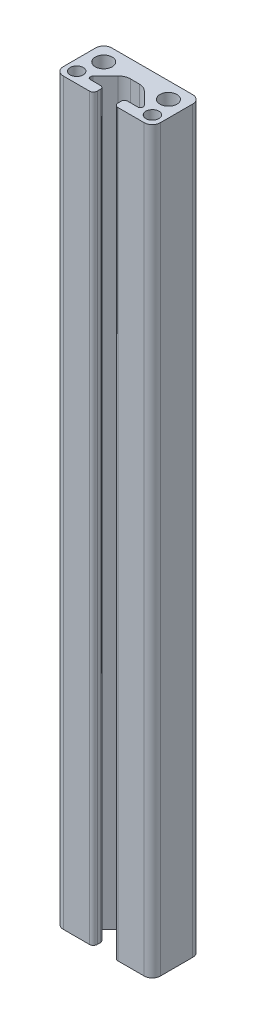
ISO-10303-21;
HEADER;
FILE_DESCRIPTION(('STEP AP214'),'2;1');
FILE_NAME('part.step','',(''),(''),'','','');
FILE_SCHEMA(('AUTOMOTIVE_DESIGN { 1 0 10303 214 1 1 1 1 }'));
ENDSEC;
DATA;
#1=APPLICATION_CONTEXT('core data for automotive mechanical design processes');
#2=APPLICATION_PROTOCOL_DEFINITION('international standard','automotive_design',2000,#1);
#3=PRODUCT_CONTEXT('',#1,'mechanical');
#4=PRODUCT('Part','Part','',(#3));
#5=PRODUCT_RELATED_PRODUCT_CATEGORY('part','',(#4));
#6=PRODUCT_DEFINITION_FORMATION('','',#4);
#7=PRODUCT_DEFINITION_CONTEXT('part definition',#1,'design');
#8=PRODUCT_DEFINITION('design','',#6,#7);
#9=PRODUCT_DEFINITION_SHAPE('','',#8);
#10=(LENGTH_UNIT() NAMED_UNIT(*) SI_UNIT(.MILLI.,.METRE.));
#11=(NAMED_UNIT(*) PLANE_ANGLE_UNIT() SI_UNIT($,.RADIAN.));
#12=(NAMED_UNIT(*) SI_UNIT($,.STERADIAN.) SOLID_ANGLE_UNIT());
#13=UNCERTAINTY_MEASURE_WITH_UNIT(LENGTH_MEASURE(1.E-05),#10,'distance_accuracy_value','');
#14=(GEOMETRIC_REPRESENTATION_CONTEXT(3) GLOBAL_UNCERTAINTY_ASSIGNED_CONTEXT((#13)) GLOBAL_UNIT_ASSIGNED_CONTEXT((#10,
#11,#12)) REPRESENTATION_CONTEXT('',''));
#15=CARTESIAN_POINT('',(0.,0.,0.));
#16=DIRECTION('',(0.,0.,1.));
#17=DIRECTION('',(1.,0.,0.));
#18=AXIS2_PLACEMENT_3D('',#15,#16,#17);
#19=CARTESIAN_POINT('',(-9.39799999999997,-145.,4.5719999999999));
#20=DIRECTION('',(0.,1.,0.));
#21=DIRECTION('',(0.,0.,1.));
#22=AXIS2_PLACEMENT_3D('',#19,#20,#21);
#23=CYLINDRICAL_SURFACE('',#22,0.889);
#24=CARTESIAN_POINT('',(-9.39799999999997,145.,4.5719999999999));
#25=DIRECTION('',(0.,1.,0.));
#26=DIRECTION('',(0.,0.,-1.));
#27=AXIS2_PLACEMENT_3D('',#24,#25,#26);
#28=CIRCLE('',#27,0.889);
#29=CARTESIAN_POINT('',(-10.287,145.,4.5719999999999));
#30=VERTEX_POINT('',#29);
#31=CARTESIAN_POINT('',(-9.39799999999997,145.,5.4609999999999));
#32=VERTEX_POINT('',#31);
#33=EDGE_CURVE('E354',#30,#32,#28,.T.);
#34=ORIENTED_EDGE('',*,*,#33,.T.);
#35=DIRECTION('',(0.,1.,0.));
#36=VECTOR('',#35,1.);
#37=CARTESIAN_POINT('',(-9.39799999999997,-145.,5.4609999999999));
#38=LINE('',#37,#36);
#39=CARTESIAN_POINT('',(-9.39799999999997,-145.,5.4609999999999));
#40=VERTEX_POINT('',#39);
#41=EDGE_CURVE('E13',#40,#32,#38,.T.);
#42=ORIENTED_EDGE('',*,*,#41,.F.);
#43=CARTESIAN_POINT('',(-9.39799999999997,-145.,4.5719999999999));
#44=DIRECTION('',(0.,1.,0.));
#45=DIRECTION('',(0.,0.,-1.));
#46=AXIS2_PLACEMENT_3D('',#43,#44,#45);
#47=CIRCLE('',#46,0.889);
#48=CARTESIAN_POINT('',(-10.287,-145.,4.5719999999999));
#49=VERTEX_POINT('',#48);
#50=EDGE_CURVE('E555',#49,#40,#47,.T.);
#51=ORIENTED_EDGE('',*,*,#50,.F.);
#52=DIRECTION('',(0.,1.,0.));
#53=VECTOR('',#52,1.);
#54=CARTESIAN_POINT('',(-10.287,-145.,4.5719999999999));
#55=LINE('',#54,#53);
#56=EDGE_CURVE('E338',#49,#30,#55,.T.);
#57=ORIENTED_EDGE('',*,*,#56,.T.);
#58=EDGE_LOOP('',(#34,#42,#51,#57));
#59=FACE_BOUND('',#58,.T.);
#60=ADVANCED_FACE('F125',(#59),#23,.F.);
#61=CARTESIAN_POINT('',(-9.39799999999997,-145.,5.4609999999999));
#62=DIRECTION('',(0.,0.,1.));
#63=DIRECTION('',(1.,0.,0.));
#64=AXIS2_PLACEMENT_3D('',#61,#62,#63);
#65=PLANE('',#64);
#66=DIRECTION('',(1.,0.,0.));
#67=VECTOR('',#66,1.);
#68=CARTESIAN_POINT('',(-9.39799999999997,145.,5.4609999999999));
#69=LINE('',#68,#67);
#70=CARTESIAN_POINT('',(-5.33399999999997,145.,5.4609999999999));
#71=VERTEX_POINT('',#70);
#72=EDGE_CURVE('E357',#32,#71,#69,.T.);
#73=ORIENTED_EDGE('',*,*,#72,.T.);
#74=DIRECTION('',(0.,1.,0.));
#75=VECTOR('',#74,1.);
#76=CARTESIAN_POINT('',(-5.33399999999997,-145.,5.4609999999999));
#77=LINE('',#76,#75);
#78=CARTESIAN_POINT('',(-5.33399999999997,-145.,5.4609999999999));
#79=VERTEX_POINT('',#78);
#80=EDGE_CURVE('E134',#79,#71,#77,.T.);
#81=ORIENTED_EDGE('',*,*,#80,.F.);
#82=DIRECTION('',(1.,0.,0.));
#83=VECTOR('',#82,1.);
#84=CARTESIAN_POINT('',(-9.39799999999997,-145.,5.4609999999999));
#85=LINE('',#84,#83);
#86=EDGE_CURVE('E245',#40,#79,#85,.T.);
#87=ORIENTED_EDGE('',*,*,#86,.F.);
#88=ORIENTED_EDGE('',*,*,#41,.T.);
#89=EDGE_LOOP('',(#73,#81,#87,#88));
#90=FACE_BOUND('',#89,.T.);
#91=ADVANCED_FACE('F570',(#90),#65,.F.);
#92=CARTESIAN_POINT('',(-5.33399999999997,-145.,6.7309999999999));
#93=DIRECTION('',(0.,1.,0.));
#94=DIRECTION('',(0.,0.,1.));
#95=AXIS2_PLACEMENT_3D('',#92,#93,#94);
#96=CYLINDRICAL_SURFACE('',#95,1.27);
#97=CARTESIAN_POINT('',(-5.33399999999997,145.,6.7309999999999));
#98=DIRECTION('',(0.,-1.,0.));
#99=DIRECTION('',(0.,0.,-1.));
#100=AXIS2_PLACEMENT_3D('',#97,#98,#99);
#101=CIRCLE('',#100,1.27);
#102=CARTESIAN_POINT('',(-4.06399999999997,145.,6.7309999999999));
#103=VERTEX_POINT('',#102);
#104=EDGE_CURVE('E359',#71,#103,#101,.T.);
#105=ORIENTED_EDGE('',*,*,#104,.T.);
#106=DIRECTION('',(0.,1.,0.));
#107=VECTOR('',#106,1.);
#108=CARTESIAN_POINT('',(-4.06399999999997,-145.,6.7309999999999));
#109=LINE('',#108,#107);
#110=CARTESIAN_POINT('',(-4.06399999999997,-145.,6.7309999999999));
#111=VERTEX_POINT('',#110);
#112=EDGE_CURVE('E475',#111,#103,#109,.T.);
#113=ORIENTED_EDGE('',*,*,#112,.F.);
#114=CARTESIAN_POINT('',(-5.33399999999997,-145.,6.7309999999999));
#115=DIRECTION('',(0.,-1.,0.));
#116=DIRECTION('',(0.,0.,-1.));
#117=AXIS2_PLACEMENT_3D('',#114,#115,#116);
#118=CIRCLE('',#117,1.27);
#119=EDGE_CURVE('E483',#79,#111,#118,.T.);
#120=ORIENTED_EDGE('',*,*,#119,.F.);
#121=ORIENTED_EDGE('',*,*,#80,.T.);
#122=EDGE_LOOP('',(#105,#113,#120,#121));
#123=FACE_BOUND('',#122,.T.);
#124=ADVANCED_FACE('F481',(#123),#96,.T.);
#125=CARTESIAN_POINT('',(-4.06399999999996,-145.,6.7309999999999));
#126=DIRECTION('',(-1.,0.,0.));
#127=DIRECTION('',(0.,0.,1.));
#128=AXIS2_PLACEMENT_3D('',#125,#126,#127);
#129=PLANE('',#128);
#130=DIRECTION('',(0.,0.,1.));
#131=VECTOR('',#130,1.);
#132=CARTESIAN_POINT('',(-4.06399999999996,145.,6.7309999999999));
#133=LINE('',#132,#131);
#134=CARTESIAN_POINT('',(-4.06399999999996,145.,8.00099999999999));
#135=VERTEX_POINT('',#134);
#136=EDGE_CURVE('E361',#103,#135,#133,.T.);
#137=ORIENTED_EDGE('',*,*,#136,.T.);
#138=DIRECTION('',(0.,1.,0.));
#139=VECTOR('',#138,1.);
#140=CARTESIAN_POINT('',(-4.06399999999996,-145.,8.00099999999999));
#141=LINE('',#140,#139);
#142=CARTESIAN_POINT('',(-4.06399999999996,-145.,8.00099999999999));
#143=VERTEX_POINT('',#142);
#144=EDGE_CURVE('E472',#143,#135,#141,.T.);
#145=ORIENTED_EDGE('',*,*,#144,.F.);
#146=DIRECTION('',(0.,0.,1.));
#147=VECTOR('',#146,1.);
#148=CARTESIAN_POINT('',(-4.06399999999996,-145.,6.7309999999999));
#149=LINE('',#148,#147);
#150=EDGE_CURVE('E501',#111,#143,#149,.T.);
#151=ORIENTED_EDGE('',*,*,#150,.F.);
#152=ORIENTED_EDGE('',*,*,#112,.T.);
#153=EDGE_LOOP('',(#137,#145,#151,#152));
#154=FACE_BOUND('',#153,.T.);
#155=ADVANCED_FACE('F492',(#154),#129,.F.);
#156=CARTESIAN_POINT('',(-5.58799999999996,-145.,8.00099999999999));
#157=DIRECTION('',(0.,1.,0.));
#158=DIRECTION('',(0.,0.,1.));
#159=AXIS2_PLACEMENT_3D('',#156,#157,#158);
#160=CYLINDRICAL_SURFACE('',#159,1.52399999999999);
#161=CARTESIAN_POINT('',(-5.58799999999996,145.,8.00099999999999));
#162=DIRECTION('',(0.,-1.,0.));
#163=DIRECTION('',(0.,0.,-1.));
#164=AXIS2_PLACEMENT_3D('',#161,#162,#163);
#165=CIRCLE('',#164,1.52399999999999);
#166=CARTESIAN_POINT('',(-5.58799999999996,145.,9.52499999999999));
#167=VERTEX_POINT('',#166);
#168=EDGE_CURVE('E363',#135,#167,#165,.T.);
#169=ORIENTED_EDGE('',*,*,#168,.T.);
#170=DIRECTION('',(0.,1.,0.));
#171=VECTOR('',#170,1.);
#172=CARTESIAN_POINT('',(-5.58799999999996,-145.,9.52499999999999));
#173=LINE('',#172,#171);
#174=CARTESIAN_POINT('',(-5.58799999999996,-145.,9.52499999999999));
#175=VERTEX_POINT('',#174);
#176=EDGE_CURVE('E469',#175,#167,#173,.T.);
#177=ORIENTED_EDGE('',*,*,#176,.F.);
#178=CARTESIAN_POINT('',(-5.58799999999996,-145.,8.00099999999999));
#179=DIRECTION('',(0.,-1.,0.));
#180=DIRECTION('',(0.,0.,-1.));
#181=AXIS2_PLACEMENT_3D('',#178,#179,#180);
#182=CIRCLE('',#181,1.52399999999999);
#183=EDGE_CURVE('E498',#143,#175,#182,.T.);
#184=ORIENTED_EDGE('',*,*,#183,.F.);
#185=ORIENTED_EDGE('',*,*,#144,.T.);
#186=EDGE_LOOP('',(#169,#177,#184,#185));
#187=FACE_BOUND('',#186,.T.);
#188=ADVANCED_FACE('F496',(#187),#160,.T.);
#189=CARTESIAN_POINT('',(-5.58799999999996,-145.,9.52499999999999));
#190=DIRECTION('',(0.,0.,-1.));
#191=DIRECTION('',(-1.,0.,0.));
#192=AXIS2_PLACEMENT_3D('',#189,#190,#191);
#193=PLANE('',#192);
#194=DIRECTION('',(-1.,0.,0.));
#195=VECTOR('',#194,1.);
#196=CARTESIAN_POINT('',(-5.58799999999996,145.,9.52499999999999));
#197=LINE('',#196,#195);
#198=CARTESIAN_POINT('',(-15.875,145.,9.52499999999998));
#199=VERTEX_POINT('',#198);
#200=EDGE_CURVE('E365',#167,#199,#197,.T.);
#201=ORIENTED_EDGE('',*,*,#200,.T.);
#202=DIRECTION('',(0.,1.,0.));
#203=VECTOR('',#202,1.);
#204=CARTESIAN_POINT('',(-15.875,-145.,9.52499999999998));
#205=LINE('',#204,#203);
#206=CARTESIAN_POINT('',(-15.875,-145.,9.52499999999998));
#207=VERTEX_POINT('',#206);
#208=EDGE_CURVE('E466',#207,#199,#205,.T.);
#209=ORIENTED_EDGE('',*,*,#208,.F.);
#210=DIRECTION('',(-1.,0.,0.));
#211=VECTOR('',#210,1.);
#212=CARTESIAN_POINT('',(-5.58799999999996,-145.,9.52499999999999));
#213=LINE('',#212,#211);
#214=EDGE_CURVE('E500',#175,#207,#213,.T.);
#215=ORIENTED_EDGE('',*,*,#214,.F.);
#216=ORIENTED_EDGE('',*,*,#176,.T.);
#217=EDGE_LOOP('',(#201,#209,#215,#216));
#218=FACE_BOUND('',#217,.T.);
#219=ADVANCED_FACE('F864',(#218),#193,.F.);
#220=CARTESIAN_POINT('',(-15.875,-145.,6.34999999999999));
#221=DIRECTION('',(0.,1.,0.));
#222=DIRECTION('',(0.,0.,1.));
#223=AXIS2_PLACEMENT_3D('',#220,#221,#222);
#224=CYLINDRICAL_SURFACE('',#223,3.175);
#225=CARTESIAN_POINT('',(-15.875,145.,6.34999999999999));
#226=DIRECTION('',(0.,-1.,0.));
#227=DIRECTION('',(0.,0.,-1.));
#228=AXIS2_PLACEMENT_3D('',#225,#226,#227);
#229=CIRCLE('',#228,3.175);
#230=CARTESIAN_POINT('',(-19.05,145.,6.34999999999999));
#231=VERTEX_POINT('',#230);
#232=EDGE_CURVE('E367',#199,#231,#229,.T.);
#233=ORIENTED_EDGE('',*,*,#232,.T.);
#234=DIRECTION('',(0.,1.,0.));
#235=VECTOR('',#234,1.);
#236=CARTESIAN_POINT('',(-19.05,-145.,6.34999999999999));
#237=LINE('',#236,#235);
#238=CARTESIAN_POINT('',(-19.05,-145.,6.34999999999999));
#239=VERTEX_POINT('',#238);
#240=EDGE_CURVE('E463',#239,#231,#237,.T.);
#241=ORIENTED_EDGE('',*,*,#240,.F.);
#242=CARTESIAN_POINT('',(-15.875,-145.,6.34999999999999));
#243=DIRECTION('',(0.,-1.,0.));
#244=DIRECTION('',(0.,0.,-1.));
#245=AXIS2_PLACEMENT_3D('',#242,#243,#244);
#246=CIRCLE('',#245,3.175);
#247=EDGE_CURVE('E503',#207,#239,#246,.T.);
#248=ORIENTED_EDGE('',*,*,#247,.F.);
#249=ORIENTED_EDGE('',*,*,#208,.T.);
#250=EDGE_LOOP('',(#233,#241,#248,#249));
#251=FACE_BOUND('',#250,.T.);
#252=ADVANCED_FACE('F853',(#251),#224,.T.);
#253=CARTESIAN_POINT('',(-19.05,-145.,6.34999999999999));
#254=DIRECTION('',(1.,0.,0.));
#255=DIRECTION('',(0.,0.,-1.));
#256=AXIS2_PLACEMENT_3D('',#253,#254,#255);
#257=PLANE('',#256);
#258=DIRECTION('',(0.,0.,-1.));
#259=VECTOR('',#258,1.);
#260=CARTESIAN_POINT('',(-19.05,145.,6.34999999999999));
#261=LINE('',#260,#259);
#262=CARTESIAN_POINT('',(-19.05,145.,-6.35000000000002));
#263=VERTEX_POINT('',#262);
#264=EDGE_CURVE('E369',#231,#263,#261,.T.);
#265=ORIENTED_EDGE('',*,*,#264,.T.);
#266=DIRECTION('',(0.,1.,0.));
#267=VECTOR('',#266,1.);
#268=CARTESIAN_POINT('',(-19.05,-145.,-6.35000000000002));
#269=LINE('',#268,#267);
#270=CARTESIAN_POINT('',(-19.05,-145.,-6.35000000000002));
#271=VERTEX_POINT('',#270);
#272=EDGE_CURVE('E460',#271,#263,#269,.T.);
#273=ORIENTED_EDGE('',*,*,#272,.F.);
#274=DIRECTION('',(0.,0.,-1.));
#275=VECTOR('',#274,1.);
#276=CARTESIAN_POINT('',(-19.05,-145.,6.34999999999999));
#277=LINE('',#276,#275);
#278=EDGE_CURVE('E509',#239,#271,#277,.T.);
#279=ORIENTED_EDGE('',*,*,#278,.F.);
#280=ORIENTED_EDGE('',*,*,#240,.T.);
#281=EDGE_LOOP('',(#265,#273,#279,#280));
#282=FACE_BOUND('',#281,.T.);
#283=ADVANCED_FACE('F842',(#282),#257,.F.);
#284=CARTESIAN_POINT('',(-15.875,-145.,-6.35000000000002));
#285=DIRECTION('',(0.,1.,0.));
#286=DIRECTION('',(0.,0.,1.));
#287=AXIS2_PLACEMENT_3D('',#284,#285,#286);
#288=CYLINDRICAL_SURFACE('',#287,3.175);
#289=CARTESIAN_POINT('',(-15.875,145.,-6.35000000000002));
#290=DIRECTION('',(0.,-1.,0.));
#291=DIRECTION('',(0.,0.,-1.));
#292=AXIS2_PLACEMENT_3D('',#289,#290,#291);
#293=CIRCLE('',#292,3.175);
#294=CARTESIAN_POINT('',(-15.875,145.,-9.52500000000001));
#295=VERTEX_POINT('',#294);
#296=EDGE_CURVE('E371',#263,#295,#293,.T.);
#297=ORIENTED_EDGE('',*,*,#296,.T.);
#298=DIRECTION('',(0.,1.,0.));
#299=VECTOR('',#298,1.);
#300=CARTESIAN_POINT('',(-15.875,-145.,-9.52500000000001));
#301=LINE('',#300,#299);
#302=CARTESIAN_POINT('',(-15.875,-145.,-9.52500000000001));
#303=VERTEX_POINT('',#302);
#304=EDGE_CURVE('E457',#303,#295,#301,.T.);
#305=ORIENTED_EDGE('',*,*,#304,.F.);
#306=CARTESIAN_POINT('',(-15.875,-145.,-6.35000000000002));
#307=DIRECTION('',(0.,-1.,0.));
#308=DIRECTION('',(0.,0.,-1.));
#309=AXIS2_PLACEMENT_3D('',#306,#307,#308);
#310=CIRCLE('',#309,3.175);
#311=EDGE_CURVE('E511',#271,#303,#310,.T.);
#312=ORIENTED_EDGE('',*,*,#311,.F.);
#313=ORIENTED_EDGE('',*,*,#272,.T.);
#314=EDGE_LOOP('',(#297,#305,#312,#313));
#315=FACE_BOUND('',#314,.T.);
#316=ADVANCED_FACE('F831',(#315),#288,.T.);
#317=CARTESIAN_POINT('',(-15.875,-145.,-9.52500000000001));
#318=DIRECTION('',(0.,0.,1.));
#319=DIRECTION('',(1.,0.,0.));
#320=AXIS2_PLACEMENT_3D('',#317,#318,#319);
#321=PLANE('',#320);
#322=DIRECTION('',(1.,0.,0.));
#323=VECTOR('',#322,1.);
#324=CARTESIAN_POINT('',(-15.875,145.,-9.52500000000001));
#325=LINE('',#324,#323);
#326=CARTESIAN_POINT('',(15.875,145.,-9.52500000000002));
#327=VERTEX_POINT('',#326);
#328=EDGE_CURVE('E373',#295,#327,#325,.T.);
#329=ORIENTED_EDGE('',*,*,#328,.T.);
#330=DIRECTION('',(0.,1.,0.));
#331=VECTOR('',#330,1.);
#332=CARTESIAN_POINT('',(15.875,-145.,-9.52500000000002));
#333=LINE('',#332,#331);
#334=CARTESIAN_POINT('',(15.875,-145.,-9.52500000000002));
#335=VERTEX_POINT('',#334);
#336=EDGE_CURVE('E454',#335,#327,#333,.T.);
#337=ORIENTED_EDGE('',*,*,#336,.F.);
#338=DIRECTION('',(1.,0.,0.));
#339=VECTOR('',#338,1.);
#340=CARTESIAN_POINT('',(-15.875,-145.,-9.52500000000001));
#341=LINE('',#340,#339);
#342=EDGE_CURVE('E513',#303,#335,#341,.T.);
#343=ORIENTED_EDGE('',*,*,#342,.F.);
#344=ORIENTED_EDGE('',*,*,#304,.T.);
#345=EDGE_LOOP('',(#329,#337,#343,#344));
#346=FACE_BOUND('',#345,.T.);
#347=ADVANCED_FACE('F820',(#346),#321,.F.);
#348=CARTESIAN_POINT('',(15.875,-145.,-6.35000000000002));
#349=DIRECTION('',(0.,1.,0.));
#350=DIRECTION('',(0.,0.,1.));
#351=AXIS2_PLACEMENT_3D('',#348,#349,#350);
#352=CYLINDRICAL_SURFACE('',#351,3.175);
#353=CARTESIAN_POINT('',(15.875,145.,-6.35000000000002));
#354=DIRECTION('',(0.,-1.,0.));
#355=DIRECTION('',(0.,0.,-1.));
#356=AXIS2_PLACEMENT_3D('',#353,#354,#355);
#357=CIRCLE('',#356,3.175);
#358=CARTESIAN_POINT('',(19.05,145.,-6.35000000000002));
#359=VERTEX_POINT('',#358);
#360=EDGE_CURVE('E375',#327,#359,#357,.T.);
#361=ORIENTED_EDGE('',*,*,#360,.T.);
#362=DIRECTION('',(0.,1.,0.));
#363=VECTOR('',#362,1.);
#364=CARTESIAN_POINT('',(19.05,-145.,-6.35000000000002));
#365=LINE('',#364,#363);
#366=CARTESIAN_POINT('',(19.05,-145.,-6.35000000000002));
#367=VERTEX_POINT('',#366);
#368=EDGE_CURVE('E451',#367,#359,#365,.T.);
#369=ORIENTED_EDGE('',*,*,#368,.F.);
#370=CARTESIAN_POINT('',(15.875,-145.,-6.35000000000002));
#371=DIRECTION('',(0.,-1.,0.));
#372=DIRECTION('',(0.,0.,-1.));
#373=AXIS2_PLACEMENT_3D('',#370,#371,#372);
#374=CIRCLE('',#373,3.175);
#375=EDGE_CURVE('E515',#335,#367,#374,.T.);
#376=ORIENTED_EDGE('',*,*,#375,.F.);
#377=ORIENTED_EDGE('',*,*,#336,.T.);
#378=EDGE_LOOP('',(#361,#369,#376,#377));
#379=FACE_BOUND('',#378,.T.);
#380=ADVANCED_FACE('F809',(#379),#352,.T.);
#381=CARTESIAN_POINT('',(19.05,-145.,-6.35000000000002));
#382=DIRECTION('',(-1.,0.,0.));
#383=DIRECTION('',(0.,0.,1.));
#384=AXIS2_PLACEMENT_3D('',#381,#382,#383);
#385=PLANE('',#384);
#386=DIRECTION('',(0.,0.,1.));
#387=VECTOR('',#386,1.);
#388=CARTESIAN_POINT('',(19.05,145.,-6.35000000000002));
#389=LINE('',#388,#387);
#390=CARTESIAN_POINT('',(19.05,145.,6.34999999999998));
#391=VERTEX_POINT('',#390);
#392=EDGE_CURVE('E377',#359,#391,#389,.T.);
#393=ORIENTED_EDGE('',*,*,#392,.T.);
#394=DIRECTION('',(0.,1.,0.));
#395=VECTOR('',#394,1.);
#396=CARTESIAN_POINT('',(19.05,-145.,6.34999999999998));
#397=LINE('',#396,#395);
#398=CARTESIAN_POINT('',(19.05,-145.,6.34999999999998));
#399=VERTEX_POINT('',#398);
#400=EDGE_CURVE('E448',#399,#391,#397,.T.);
#401=ORIENTED_EDGE('',*,*,#400,.F.);
#402=DIRECTION('',(0.,0.,1.));
#403=VECTOR('',#402,1.);
#404=CARTESIAN_POINT('',(19.05,-145.,-6.35000000000002));
#405=LINE('',#404,#403);
#406=EDGE_CURVE('E517',#367,#399,#405,.T.);
#407=ORIENTED_EDGE('',*,*,#406,.F.);
#408=ORIENTED_EDGE('',*,*,#368,.T.);
#409=EDGE_LOOP('',(#393,#401,#407,#408));
#410=FACE_BOUND('',#409,.T.);
#411=ADVANCED_FACE('F798',(#410),#385,.F.);
#412=CARTESIAN_POINT('',(15.875,-145.,6.34999999999998));
#413=DIRECTION('',(0.,1.,0.));
#414=DIRECTION('',(0.,0.,1.));
#415=AXIS2_PLACEMENT_3D('',#412,#413,#414);
#416=CYLINDRICAL_SURFACE('',#415,3.175);
#417=CARTESIAN_POINT('',(15.875,145.,6.34999999999998));
#418=DIRECTION('',(0.,-1.,0.));
#419=DIRECTION('',(0.,0.,-1.));
#420=AXIS2_PLACEMENT_3D('',#417,#418,#419);
#421=CIRCLE('',#420,3.175);
#422=CARTESIAN_POINT('',(15.875,145.,9.52499999999999));
#423=VERTEX_POINT('',#422);
#424=EDGE_CURVE('E379',#391,#423,#421,.T.);
#425=ORIENTED_EDGE('',*,*,#424,.T.);
#426=DIRECTION('',(0.,1.,0.));
#427=VECTOR('',#426,1.);
#428=CARTESIAN_POINT('',(15.875,-145.,9.52499999999999));
#429=LINE('',#428,#427);
#430=CARTESIAN_POINT('',(15.875,-145.,9.52499999999999));
#431=VERTEX_POINT('',#430);
#432=EDGE_CURVE('E445',#431,#423,#429,.T.);
#433=ORIENTED_EDGE('',*,*,#432,.F.);
#434=CARTESIAN_POINT('',(15.875,-145.,6.34999999999998));
#435=DIRECTION('',(0.,-1.,0.));
#436=DIRECTION('',(0.,0.,-1.));
#437=AXIS2_PLACEMENT_3D('',#434,#435,#436);
#438=CIRCLE('',#437,3.175);
#439=EDGE_CURVE('E519',#399,#431,#438,.T.);
#440=ORIENTED_EDGE('',*,*,#439,.F.);
#441=ORIENTED_EDGE('',*,*,#400,.T.);
#442=EDGE_LOOP('',(#425,#433,#440,#441));
#443=FACE_BOUND('',#442,.T.);
#444=ADVANCED_FACE('F787',(#443),#416,.T.);
#445=CARTESIAN_POINT('',(15.875,-145.,9.52499999999999));
#446=DIRECTION('',(0.,0.,-1.));
#447=DIRECTION('',(-1.,0.,0.));
#448=AXIS2_PLACEMENT_3D('',#445,#446,#447);
#449=PLANE('',#448);
#450=DIRECTION('',(-1.,0.,0.));
#451=VECTOR('',#450,1.);
#452=CARTESIAN_POINT('',(15.875,145.,9.52499999999999));
#453=LINE('',#452,#451);
#454=CARTESIAN_POINT('',(5.58800000000002,145.,9.52499999999999));
#455=VERTEX_POINT('',#454);
#456=EDGE_CURVE('E381',#423,#455,#453,.T.);
#457=ORIENTED_EDGE('',*,*,#456,.T.);
#458=DIRECTION('',(0.,1.,0.));
#459=VECTOR('',#458,1.);
#460=CARTESIAN_POINT('',(5.58800000000002,-145.,9.52499999999999));
#461=LINE('',#460,#459);
#462=CARTESIAN_POINT('',(5.58800000000002,-145.,9.52499999999999));
#463=VERTEX_POINT('',#462);
#464=EDGE_CURVE('E442',#463,#455,#461,.T.);
#465=ORIENTED_EDGE('',*,*,#464,.F.);
#466=DIRECTION('',(-1.,0.,0.));
#467=VECTOR('',#466,1.);
#468=CARTESIAN_POINT('',(15.875,-145.,9.52499999999999));
#469=LINE('',#468,#467);
#470=EDGE_CURVE('E521',#431,#463,#469,.T.);
#471=ORIENTED_EDGE('',*,*,#470,.F.);
#472=ORIENTED_EDGE('',*,*,#432,.T.);
#473=EDGE_LOOP('',(#457,#465,#471,#472));
#474=FACE_BOUND('',#473,.T.);
#475=ADVANCED_FACE('F776',(#474),#449,.F.);
#476=CARTESIAN_POINT('',(5.58800000000002,-145.,8.00100000000001));
#477=DIRECTION('',(0.,1.,0.));
#478=DIRECTION('',(0.,0.,1.));
#479=AXIS2_PLACEMENT_3D('',#476,#477,#478);
#480=CYLINDRICAL_SURFACE('',#479,1.52399999999998);
#481=CARTESIAN_POINT('',(5.58800000000002,145.,8.00100000000001));
#482=DIRECTION('',(0.,-1.,0.));
#483=DIRECTION('',(0.,0.,-1.));
#484=AXIS2_PLACEMENT_3D('',#481,#482,#483);
#485=CIRCLE('',#484,1.52399999999998);
#486=CARTESIAN_POINT('',(4.06400000000004,145.,8.00100000000001));
#487=VERTEX_POINT('',#486);
#488=EDGE_CURVE('E383',#455,#487,#485,.T.);
#489=ORIENTED_EDGE('',*,*,#488,.T.);
#490=DIRECTION('',(0.,1.,0.));
#491=VECTOR('',#490,1.);
#492=CARTESIAN_POINT('',(4.06400000000004,-145.,8.00100000000001));
#493=LINE('',#492,#491);
#494=CARTESIAN_POINT('',(4.06400000000004,-145.,8.00100000000001));
#495=VERTEX_POINT('',#494);
#496=EDGE_CURVE('E439',#495,#487,#493,.T.);
#497=ORIENTED_EDGE('',*,*,#496,.F.);
#498=CARTESIAN_POINT('',(5.58800000000002,-145.,8.00100000000001));
#499=DIRECTION('',(0.,-1.,0.));
#500=DIRECTION('',(0.,0.,-1.));
#501=AXIS2_PLACEMENT_3D('',#498,#499,#500);
#502=CIRCLE('',#501,1.52399999999998);
#503=EDGE_CURVE('E523',#463,#495,#502,.T.);
#504=ORIENTED_EDGE('',*,*,#503,.F.);
#505=ORIENTED_EDGE('',*,*,#464,.T.);
#506=EDGE_LOOP('',(#489,#497,#504,#505));
#507=FACE_BOUND('',#506,.T.);
#508=ADVANCED_FACE('F765',(#507),#480,.T.);
#509=CARTESIAN_POINT('',(4.06400000000004,-145.,8.00100000000001));
#510=DIRECTION('',(1.,0.,0.));
#511=DIRECTION('',(0.,0.,-1.));
#512=AXIS2_PLACEMENT_3D('',#509,#510,#511);
#513=PLANE('',#512);
#514=DIRECTION('',(0.,0.,-1.));
#515=VECTOR('',#514,1.);
#516=CARTESIAN_POINT('',(4.06400000000004,145.,8.00100000000001));
#517=LINE('',#516,#515);
#518=CARTESIAN_POINT('',(4.06400000000003,145.,6.73099999999988));
#519=VERTEX_POINT('',#518);
#520=EDGE_CURVE('E385',#487,#519,#517,.T.);
#521=ORIENTED_EDGE('',*,*,#520,.T.);
#522=DIRECTION('',(0.,1.,0.));
#523=VECTOR('',#522,1.);
#524=CARTESIAN_POINT('',(4.06400000000003,-145.,6.73099999999988));
#525=LINE('',#524,#523);
#526=CARTESIAN_POINT('',(4.06400000000003,-145.,6.73099999999988));
#527=VERTEX_POINT('',#526);
#528=EDGE_CURVE('E436',#527,#519,#525,.T.);
#529=ORIENTED_EDGE('',*,*,#528,.F.);
#530=DIRECTION('',(0.,0.,-1.));
#531=VECTOR('',#530,1.);
#532=CARTESIAN_POINT('',(4.06400000000004,-145.,8.00100000000001));
#533=LINE('',#532,#531);
#534=EDGE_CURVE('E525',#495,#527,#533,.T.);
#535=ORIENTED_EDGE('',*,*,#534,.F.);
#536=ORIENTED_EDGE('',*,*,#496,.T.);
#537=EDGE_LOOP('',(#521,#529,#535,#536));
#538=FACE_BOUND('',#537,.T.);
#539=ADVANCED_FACE('F754',(#538),#513,.F.);
#540=CARTESIAN_POINT('',(5.33400000000001,-145.,6.73099999999988));
#541=DIRECTION('',(0.,1.,0.));
#542=DIRECTION('',(0.,0.,1.));
#543=AXIS2_PLACEMENT_3D('',#540,#541,#542);
#544=CYLINDRICAL_SURFACE('',#543,1.26999999999998);
#545=CARTESIAN_POINT('',(5.33400000000001,145.,6.73099999999988));
#546=DIRECTION('',(0.,-1.,0.));
#547=DIRECTION('',(0.,0.,-1.));
#548=AXIS2_PLACEMENT_3D('',#545,#546,#547);
#549=CIRCLE('',#548,1.26999999999998);
#550=CARTESIAN_POINT('',(5.33400000000001,145.,5.4609999999999));
#551=VERTEX_POINT('',#550);
#552=EDGE_CURVE('E387',#519,#551,#549,.T.);
#553=ORIENTED_EDGE('',*,*,#552,.T.);
#554=DIRECTION('',(0.,1.,0.));
#555=VECTOR('',#554,1.);
#556=CARTESIAN_POINT('',(5.33400000000001,-145.,5.4609999999999));
#557=LINE('',#556,#555);
#558=CARTESIAN_POINT('',(5.33400000000001,-145.,5.4609999999999));
#559=VERTEX_POINT('',#558);
#560=EDGE_CURVE('E433',#559,#551,#557,.T.);
#561=ORIENTED_EDGE('',*,*,#560,.F.);
#562=CARTESIAN_POINT('',(5.33400000000001,-145.,6.73099999999988));
#563=DIRECTION('',(0.,-1.,0.));
#564=DIRECTION('',(0.,0.,-1.));
#565=AXIS2_PLACEMENT_3D('',#562,#563,#564);
#566=CIRCLE('',#565,1.26999999999998);
#567=EDGE_CURVE('E527',#527,#559,#566,.T.);
#568=ORIENTED_EDGE('',*,*,#567,.F.);
#569=ORIENTED_EDGE('',*,*,#528,.T.);
#570=EDGE_LOOP('',(#553,#561,#568,#569));
#571=FACE_BOUND('',#570,.T.);
#572=ADVANCED_FACE('F743',(#571),#544,.T.);
#573=CARTESIAN_POINT('',(5.33400000000001,-145.,5.4609999999999));
#574=DIRECTION('',(0.,0.,1.));
#575=DIRECTION('',(1.,0.,0.));
#576=AXIS2_PLACEMENT_3D('',#573,#574,#575);
#577=PLANE('',#576);
#578=DIRECTION('',(1.,0.,0.));
#579=VECTOR('',#578,1.);
#580=CARTESIAN_POINT('',(5.33400000000001,145.,5.4609999999999));
#581=LINE('',#580,#579);
#582=CARTESIAN_POINT('',(9.39800000000004,145.,5.4609999999999));
#583=VERTEX_POINT('',#582);
#584=EDGE_CURVE('E389',#551,#583,#581,.T.);
#585=ORIENTED_EDGE('',*,*,#584,.T.);
#586=DIRECTION('',(0.,1.,0.));
#587=VECTOR('',#586,1.);
#588=CARTESIAN_POINT('',(9.39800000000004,-145.,5.4609999999999));
#589=LINE('',#588,#587);
#590=CARTESIAN_POINT('',(9.39800000000004,-145.,5.4609999999999));
#591=VERTEX_POINT('',#590);
#592=EDGE_CURVE('E430',#591,#583,#589,.T.);
#593=ORIENTED_EDGE('',*,*,#592,.F.);
#594=DIRECTION('',(1.,0.,0.));
#595=VECTOR('',#594,1.);
#596=CARTESIAN_POINT('',(5.33400000000001,-145.,5.4609999999999));
#597=LINE('',#596,#595);
#598=EDGE_CURVE('E529',#559,#591,#597,.T.);
#599=ORIENTED_EDGE('',*,*,#598,.F.);
#600=ORIENTED_EDGE('',*,*,#560,.T.);
#601=EDGE_LOOP('',(#585,#593,#599,#600));
#602=FACE_BOUND('',#601,.T.);
#603=ADVANCED_FACE('F732',(#602),#577,.F.);
#604=CARTESIAN_POINT('',(9.39800000000004,-145.,4.5719999999999));
#605=DIRECTION('',(0.,1.,0.));
#606=DIRECTION('',(0.,0.,1.));
#607=AXIS2_PLACEMENT_3D('',#604,#605,#606);
#608=CYLINDRICAL_SURFACE('',#607,0.888999999999999);
#609=CARTESIAN_POINT('',(9.39800000000004,145.,4.5719999999999));
#610=DIRECTION('',(0.,1.,0.));
#611=DIRECTION('',(0.,0.,-1.));
#612=AXIS2_PLACEMENT_3D('',#609,#610,#611);
#613=CIRCLE('',#612,0.888999999999999);
#614=CARTESIAN_POINT('',(10.287,145.,4.5719999999999));
#615=VERTEX_POINT('',#614);
#616=EDGE_CURVE('E391',#583,#615,#613,.T.);
#617=ORIENTED_EDGE('',*,*,#616,.T.);
#618=DIRECTION('',(0.,1.,0.));
#619=VECTOR('',#618,1.);
#620=CARTESIAN_POINT('',(10.287,-145.,4.5719999999999));
#621=LINE('',#620,#619);
#622=CARTESIAN_POINT('',(10.287,-145.,4.5719999999999));
#623=VERTEX_POINT('',#622);
#624=EDGE_CURVE('E427',#623,#615,#621,.T.);
#625=ORIENTED_EDGE('',*,*,#624,.F.);
#626=CARTESIAN_POINT('',(9.39800000000004,-145.,4.5719999999999));
#627=DIRECTION('',(0.,1.,0.));
#628=DIRECTION('',(0.,0.,-1.));
#629=AXIS2_PLACEMENT_3D('',#626,#627,#628);
#630=CIRCLE('',#629,0.888999999999999);
#631=EDGE_CURVE('E531',#591,#623,#630,.T.);
#632=ORIENTED_EDGE('',*,*,#631,.F.);
#633=ORIENTED_EDGE('',*,*,#592,.T.);
#634=EDGE_LOOP('',(#617,#625,#632,#633));
#635=FACE_BOUND('',#634,.T.);
#636=ADVANCED_FACE('F721',(#635),#608,.F.);
#637=CARTESIAN_POINT('',(10.287,-145.,4.5719999999999));
#638=DIRECTION('',(1.,0.,0.));
#639=DIRECTION('',(0.,0.,-1.));
#640=AXIS2_PLACEMENT_3D('',#637,#638,#639);
#641=PLANE('',#640);
#642=DIRECTION('',(0.,0.,-1.));
#643=VECTOR('',#642,1.);
#644=CARTESIAN_POINT('',(10.287,145.,4.5719999999999));
#645=LINE('',#644,#643);
#646=CARTESIAN_POINT('',(10.287,145.,4.25536498708179));
#647=VERTEX_POINT('',#646);
#648=EDGE_CURVE('E393',#615,#647,#645,.T.);
#649=ORIENTED_EDGE('',*,*,#648,.T.);
#650=DIRECTION('',(0.,1.,0.));
#651=VECTOR('',#650,1.);
#652=CARTESIAN_POINT('',(10.287,-145.,4.25536498708179));
#653=LINE('',#652,#651);
#654=CARTESIAN_POINT('',(10.287,-145.,4.25536498708179));
#655=VERTEX_POINT('',#654);
#656=EDGE_CURVE('E424',#655,#647,#653,.T.);
#657=ORIENTED_EDGE('',*,*,#656,.F.);
#658=DIRECTION('',(0.,0.,-1.));
#659=VECTOR('',#658,1.);
#660=CARTESIAN_POINT('',(10.287,-145.,4.5719999999999));
#661=LINE('',#660,#659);
#662=EDGE_CURVE('E533',#623,#655,#661,.T.);
#663=ORIENTED_EDGE('',*,*,#662,.F.);
#664=ORIENTED_EDGE('',*,*,#624,.T.);
#665=EDGE_LOOP('',(#649,#657,#663,#664));
#666=FACE_BOUND('',#665,.T.);
#667=ADVANCED_FACE('F710',(#666),#641,.F.);
#668=CARTESIAN_POINT('',(9.39800000000006,-145.,4.25536498708179));
#669=DIRECTION('',(0.,1.,0.));
#670=DIRECTION('',(0.,0.,1.));
#671=AXIS2_PLACEMENT_3D('',#668,#669,#670);
#672=CYLINDRICAL_SURFACE('',#671,0.888999999999977);
#673=CARTESIAN_POINT('',(9.39800000000006,145.,4.25536498708179));
#674=DIRECTION('',(0.,1.,0.));
#675=DIRECTION('',(0.,0.,-1.));
#676=AXIS2_PLACEMENT_3D('',#673,#674,#675);
#677=CIRCLE('',#676,0.888999999999977);
#678=CARTESIAN_POINT('',(10.0266179284749,145.,3.62674705860696));
#679=VERTEX_POINT('',#678);
#680=EDGE_CURVE('E395',#647,#679,#677,.T.);
#681=ORIENTED_EDGE('',*,*,#680,.T.);
#682=DIRECTION('',(0.,1.,0.));
#683=VECTOR('',#682,1.);
#684=CARTESIAN_POINT('',(10.0266179284749,-145.,3.62674705860696));
#685=LINE('',#684,#683);
#686=CARTESIAN_POINT('',(10.0266179284749,-145.,3.62674705860696));
#687=VERTEX_POINT('',#686);
#688=EDGE_CURVE('E421',#687,#679,#685,.T.);
#689=ORIENTED_EDGE('',*,*,#688,.F.);
#690=CARTESIAN_POINT('',(9.39800000000006,-145.,4.25536498708179));
#691=DIRECTION('',(0.,1.,0.));
#692=DIRECTION('',(0.,0.,-1.));
#693=AXIS2_PLACEMENT_3D('',#690,#691,#692);
#694=CIRCLE('',#693,0.888999999999977);
#695=EDGE_CURVE('E535',#655,#687,#694,.T.);
#696=ORIENTED_EDGE('',*,*,#695,.F.);
#697=ORIENTED_EDGE('',*,*,#656,.T.);
#698=EDGE_LOOP('',(#681,#689,#696,#697));
#699=FACE_BOUND('',#698,.T.);
#700=ADVANCED_FACE('F699',(#699),#672,.F.);
#701=CARTESIAN_POINT('',(10.0266179284749,-145.,3.62674705860696));
#702=DIRECTION('',(0.707106781186548,0.,-0.707106781186547));
#703=DIRECTION('',(-0.707106781186547,0.,-0.707106781186548));
#704=AXIS2_PLACEMENT_3D('',#701,#702,#703);
#705=PLANE('',#704);
#706=DIRECTION('',(-0.707106781186547,0.,-0.707106781186548));
#707=VECTOR('',#706,1.);
#708=CARTESIAN_POINT('',(10.0266179284749,145.,3.62674705860696));
#709=LINE('',#708,#707);
#710=CARTESIAN_POINT('',(5.12405508058805,145.,-1.27581578927987));
#711=VERTEX_POINT('',#710);
#712=EDGE_CURVE('E397',#679,#711,#709,.T.);
#713=ORIENTED_EDGE('',*,*,#712,.T.);
#714=DIRECTION('',(0.,1.,0.));
#715=VECTOR('',#714,1.);
#716=CARTESIAN_POINT('',(5.12405508058805,-145.,-1.27581578927987));
#717=LINE('',#716,#715);
#718=CARTESIAN_POINT('',(5.12405508058805,-145.,-1.27581578927987));
#719=VERTEX_POINT('',#718);
#720=EDGE_CURVE('E418',#719,#711,#717,.T.);
#721=ORIENTED_EDGE('',*,*,#720,.F.);
#722=DIRECTION('',(-0.707106781186547,0.,-0.707106781186548));
#723=VECTOR('',#722,1.);
#724=CARTESIAN_POINT('',(10.0266179284749,-145.,3.62674705860696));
#725=LINE('',#724,#723);
#726=EDGE_CURVE('E537',#687,#719,#725,.T.);
#727=ORIENTED_EDGE('',*,*,#726,.F.);
#728=ORIENTED_EDGE('',*,*,#688,.T.);
#729=EDGE_LOOP('',(#713,#721,#727,#728));
#730=FACE_BOUND('',#729,.T.);
#731=ADVANCED_FACE('F688',(#730),#705,.F.);
#732=CARTESIAN_POINT('',(1.76543929130817,-145.,2.0828));
#733=DIRECTION('',(0.,1.,0.));
#734=DIRECTION('',(0.,0.,1.));
#735=AXIS2_PLACEMENT_3D('',#732,#733,#734);
#736=CYLINDRICAL_SURFACE('',#735,4.74980000000002);
#737=CARTESIAN_POINT('',(1.76543929130817,145.,2.0828));
#738=DIRECTION('',(0.,1.,0.));
#739=DIRECTION('',(0.,0.,-1.));
#740=AXIS2_PLACEMENT_3D('',#737,#738,#739);
#741=CIRCLE('',#740,4.74980000000002);
#742=CARTESIAN_POINT('',(1.76543929130817,145.,-2.66700000000002));
#743=VERTEX_POINT('',#742);
#744=EDGE_CURVE('E399',#711,#743,#741,.T.);
#745=ORIENTED_EDGE('',*,*,#744,.T.);
#746=DIRECTION('',(0.,1.,0.));
#747=VECTOR('',#746,1.);
#748=CARTESIAN_POINT('',(1.76543929130817,-145.,-2.66700000000002));
#749=LINE('',#748,#747);
#750=CARTESIAN_POINT('',(1.76543929130817,-145.,-2.66700000000002));
#751=VERTEX_POINT('',#750);
#752=EDGE_CURVE('E415',#751,#743,#749,.T.);
#753=ORIENTED_EDGE('',*,*,#752,.F.);
#754=CARTESIAN_POINT('',(1.76543929130817,-145.,2.0828));
#755=DIRECTION('',(0.,1.,0.));
#756=DIRECTION('',(0.,0.,-1.));
#757=AXIS2_PLACEMENT_3D('',#754,#755,#756);
#758=CIRCLE('',#757,4.74980000000002);
#759=EDGE_CURVE('E539',#719,#751,#758,.T.);
#760=ORIENTED_EDGE('',*,*,#759,.F.);
#761=ORIENTED_EDGE('',*,*,#720,.T.);
#762=EDGE_LOOP('',(#745,#753,#760,#761));
#763=FACE_BOUND('',#762,.T.);
#764=ADVANCED_FACE('F678',(#763),#736,.F.);
#765=CARTESIAN_POINT('',(1.76543929130817,-145.,-2.66700000000002));
#766=DIRECTION('',(0.,0.,-1.));
#767=DIRECTION('',(-1.,0.,0.));
#768=AXIS2_PLACEMENT_3D('',#765,#766,#767);
#769=PLANE('',#768);
#770=DIRECTION('',(-1.,0.,0.));
#771=VECTOR('',#770,1.);
#772=CARTESIAN_POINT('',(1.76543929130817,145.,-2.66700000000002));
#773=LINE('',#772,#771);
#774=CARTESIAN_POINT('',(-1.7654392913081,145.,-2.66700000000002));
#775=VERTEX_POINT('',#774);
#776=EDGE_CURVE('E401',#743,#775,#773,.T.);
#777=ORIENTED_EDGE('',*,*,#776,.T.);
#778=DIRECTION('',(0.,1.,0.));
#779=VECTOR('',#778,1.);
#780=CARTESIAN_POINT('',(-1.7654392913081,-145.,-2.66700000000002));
#781=LINE('',#780,#779);
#782=CARTESIAN_POINT('',(-1.7654392913081,-145.,-2.66700000000002));
#783=VERTEX_POINT('',#782);
#784=EDGE_CURVE('E412',#783,#775,#781,.T.);
#785=ORIENTED_EDGE('',*,*,#784,.F.);
#786=DIRECTION('',(-1.,0.,0.));
#787=VECTOR('',#786,1.);
#788=CARTESIAN_POINT('',(1.76543929130817,-145.,-2.66700000000002));
#789=LINE('',#788,#787);
#790=EDGE_CURVE('E541',#751,#783,#789,.T.);
#791=ORIENTED_EDGE('',*,*,#790,.F.);
#792=ORIENTED_EDGE('',*,*,#752,.T.);
#793=EDGE_LOOP('',(#777,#785,#791,#792));
#794=FACE_BOUND('',#793,.T.);
#795=ADVANCED_FACE('F547',(#794),#769,.F.);
#796=CARTESIAN_POINT('',(-1.7654392913081,-145.,2.0828));
#797=DIRECTION('',(0.,1.,0.));
#798=DIRECTION('',(0.,0.,1.));
#799=AXIS2_PLACEMENT_3D('',#796,#797,#798);
#800=CYLINDRICAL_SURFACE('',#799,4.74980000000002);
#801=CARTESIAN_POINT('',(-1.7654392913081,145.,2.0828));
#802=DIRECTION('',(0.,1.,0.));
#803=DIRECTION('',(0.,0.,-1.));
#804=AXIS2_PLACEMENT_3D('',#801,#802,#803);
#805=CIRCLE('',#804,4.74980000000002);
#806=CARTESIAN_POINT('',(-5.12405508058798,145.,-1.27581578927987));
#807=VERTEX_POINT('',#806);
#808=EDGE_CURVE('E403',#775,#807,#805,.T.);
#809=ORIENTED_EDGE('',*,*,#808,.T.);
#810=DIRECTION('',(0.,1.,0.));
#811=VECTOR('',#810,1.);
#812=CARTESIAN_POINT('',(-5.12405508058798,-145.,-1.27581578927987));
#813=LINE('',#812,#811);
#814=CARTESIAN_POINT('',(-5.12405508058798,-145.,-1.27581578927987));
#815=VERTEX_POINT('',#814);
#816=EDGE_CURVE('E333',#815,#807,#813,.T.);
#817=ORIENTED_EDGE('',*,*,#816,.F.);
#818=CARTESIAN_POINT('',(-1.7654392913081,-145.,2.0828));
#819=DIRECTION('',(0.,1.,0.));
#820=DIRECTION('',(0.,0.,-1.));
#821=AXIS2_PLACEMENT_3D('',#818,#819,#820);
#822=CIRCLE('',#821,4.74980000000002);
#823=EDGE_CURVE('E324',#783,#815,#822,.T.);
#824=ORIENTED_EDGE('',*,*,#823,.F.);
#825=ORIENTED_EDGE('',*,*,#784,.T.);
#826=EDGE_LOOP('',(#809,#817,#824,#825));
#827=FACE_BOUND('',#826,.T.);
#828=ADVANCED_FACE('F551',(#827),#800,.F.);
#829=CARTESIAN_POINT('',(-5.12405508058798,-145.,-1.27581578927987));
#830=DIRECTION('',(-0.707106781186547,0.,-0.707106781186548));
#831=DIRECTION('',(-0.707106781186548,0.,0.707106781186547));
#832=AXIS2_PLACEMENT_3D('',#829,#830,#831);
#833=PLANE('',#832);
#834=DIRECTION('',(-0.707106781186548,0.,0.707106781186547));
#835=VECTOR('',#834,1.);
#836=CARTESIAN_POINT('',(-5.12405508058798,145.,-1.27581578927987));
#837=LINE('',#836,#835);
#838=CARTESIAN_POINT('',(-10.0266179284748,145.,3.62674705860696));
#839=VERTEX_POINT('',#838);
#840=EDGE_CURVE('E332',#807,#839,#837,.T.);
#841=ORIENTED_EDGE('',*,*,#840,.T.);
#842=DIRECTION('',(0.,1.,0.));
#843=VECTOR('',#842,1.);
#844=CARTESIAN_POINT('',(-10.0266179284748,-145.,3.62674705860696));
#845=LINE('',#844,#843);
#846=CARTESIAN_POINT('',(-10.0266179284748,-145.,3.62674705860696));
#847=VERTEX_POINT('',#846);
#848=EDGE_CURVE('E329',#847,#839,#845,.T.);
#849=ORIENTED_EDGE('',*,*,#848,.F.);
#850=DIRECTION('',(-0.707106781186548,0.,0.707106781186547));
#851=VECTOR('',#850,1.);
#852=CARTESIAN_POINT('',(-5.12405508058798,-145.,-1.27581578927987));
#853=LINE('',#852,#851);
#854=EDGE_CURVE('E318',#815,#847,#853,.T.);
#855=ORIENTED_EDGE('',*,*,#854,.F.);
#856=ORIENTED_EDGE('',*,*,#816,.T.);
#857=EDGE_LOOP('',(#841,#849,#855,#856));
#858=FACE_BOUND('',#857,.T.);
#859=ADVANCED_FACE('F330',(#858),#833,.F.);
#860=CARTESIAN_POINT('',(-9.39799999999999,-145.,4.25536498708179));
#861=DIRECTION('',(0.,1.,0.));
#862=DIRECTION('',(0.,0.,1.));
#863=AXIS2_PLACEMENT_3D('',#860,#861,#862);
#864=CYLINDRICAL_SURFACE('',#863,0.888999999999977);
#865=CARTESIAN_POINT('',(-9.39799999999999,145.,4.25536498708179));
#866=DIRECTION('',(0.,1.,0.));
#867=DIRECTION('',(0.,0.,-1.));
#868=AXIS2_PLACEMENT_3D('',#865,#866,#867);
#869=CIRCLE('',#868,0.888999999999977);
#870=CARTESIAN_POINT('',(-10.287,145.,4.25536498708179));
#871=VERTEX_POINT('',#870);
#872=EDGE_CURVE('E231',#839,#871,#869,.T.);
#873=ORIENTED_EDGE('',*,*,#872,.T.);
#874=DIRECTION('',(0.,1.,0.));
#875=VECTOR('',#874,1.);
#876=CARTESIAN_POINT('',(-10.287,-145.,4.25536498708179));
#877=LINE('',#876,#875);
#878=CARTESIAN_POINT('',(-10.287,-145.,4.25536498708179));
#879=VERTEX_POINT('',#878);
#880=EDGE_CURVE('E334',#879,#871,#877,.T.);
#881=ORIENTED_EDGE('',*,*,#880,.F.);
#882=CARTESIAN_POINT('',(-9.39799999999999,-145.,4.25536498708179));
#883=DIRECTION('',(0.,1.,0.));
#884=DIRECTION('',(0.,0.,-1.));
#885=AXIS2_PLACEMENT_3D('',#882,#883,#884);
#886=CIRCLE('',#885,0.888999999999977);
#887=EDGE_CURVE('E322',#847,#879,#886,.T.);
#888=ORIENTED_EDGE('',*,*,#887,.F.);
#889=ORIENTED_EDGE('',*,*,#848,.T.);
#890=EDGE_LOOP('',(#873,#881,#888,#889));
#891=FACE_BOUND('',#890,.T.);
#892=ADVANCED_FACE('F336',(#891),#864,.F.);
#893=CARTESIAN_POINT('',(14.8487969585207,-145.,5.27643277339342));
#894=DIRECTION('',(0.,1.,0.));
#895=DIRECTION('',(0.,0.,1.));
#896=AXIS2_PLACEMENT_3D('',#893,#894,#895);
#897=CYLINDRICAL_SURFACE('',#896,2.55270000000001);
#898=CARTESIAN_POINT('',(14.8487969585207,-145.,5.27643277339342));
#899=DIRECTION('',(0.,-1.,0.));
#900=DIRECTION('',(0.,0.,-1.));
#901=AXIS2_PLACEMENT_3D('',#898,#899,#900);
#902=CIRCLE('',#901,2.55270000000001);
#903=CARTESIAN_POINT('',(14.8487969585207,-145.,2.72373277339341));
#904=VERTEX_POINT('',#903);
#905=EDGE_CURVE('E1009',#904,#904,#902,.T.);
#906=ORIENTED_EDGE('',*,*,#905,.T.);
#907=EDGE_LOOP('',(#906));
#908=FACE_BOUND('',#907,.T.);
#909=CARTESIAN_POINT('',(14.8487969585207,145.,5.27643277339342));
#910=DIRECTION('',(0.,-1.,0.));
#911=DIRECTION('',(0.,0.,-1.));
#912=AXIS2_PLACEMENT_3D('',#909,#910,#911);
#913=CIRCLE('',#912,2.55270000000001);
#914=CARTESIAN_POINT('',(14.8487969585207,145.,2.72373277339341));
#915=VERTEX_POINT('',#914);
#916=EDGE_CURVE('E351',#915,#915,#913,.T.);
#917=ORIENTED_EDGE('',*,*,#916,.F.);
#918=EDGE_LOOP('',(#917));
#919=FACE_BOUND('',#918,.T.);
#920=ADVANCED_FACE('F578',(#908,#919),#897,.F.);
#921=CARTESIAN_POINT('',(12.7,-145.,-3.175));
#922=DIRECTION('',(0.,1.,0.));
#923=DIRECTION('',(0.,0.,1.));
#924=AXIS2_PLACEMENT_3D('',#921,#922,#923);
#925=CYLINDRICAL_SURFACE('',#924,3.32739999999998);
#926=CARTESIAN_POINT('',(12.7,-145.,-3.175));
#927=DIRECTION('',(0.,-1.,0.));
#928=DIRECTION('',(0.,0.,-1.));
#929=AXIS2_PLACEMENT_3D('',#926,#927,#928);
#930=CIRCLE('',#929,3.32739999999998);
#931=CARTESIAN_POINT('',(12.7,-145.,-6.50239999999998));
#932=VERTEX_POINT('',#931);
#933=EDGE_CURVE('E1006',#932,#932,#930,.T.);
#934=ORIENTED_EDGE('',*,*,#933,.T.);
#935=EDGE_LOOP('',(#934));
#936=FACE_BOUND('',#935,.T.);
#937=CARTESIAN_POINT('',(12.7,145.,-3.175));
#938=DIRECTION('',(0.,-1.,0.));
#939=DIRECTION('',(0.,0.,-1.));
#940=AXIS2_PLACEMENT_3D('',#937,#938,#939);
#941=CIRCLE('',#940,3.32739999999998);
#942=CARTESIAN_POINT('',(12.7,145.,-6.50239999999998));
#943=VERTEX_POINT('',#942);
#944=EDGE_CURVE('E348',#943,#943,#941,.T.);
#945=ORIENTED_EDGE('',*,*,#944,.F.);
#946=EDGE_LOOP('',(#945));
#947=FACE_BOUND('',#946,.T.);
#948=ADVANCED_FACE('F581',(#936,#947),#925,.F.);
#949=CARTESIAN_POINT('',(-14.8487969585205,-145.,5.2764327733935));
#950=DIRECTION('',(0.,1.,0.));
#951=DIRECTION('',(0.,0.,1.));
#952=AXIS2_PLACEMENT_3D('',#949,#950,#951);
#953=CYLINDRICAL_SURFACE('',#952,2.5527);
#954=CARTESIAN_POINT('',(-14.8487969585205,-145.,5.2764327733935));
#955=DIRECTION('',(0.,-1.,0.));
#956=DIRECTION('',(0.,0.,-1.));
#957=AXIS2_PLACEMENT_3D('',#954,#955,#956);
#958=CIRCLE('',#957,2.5527);
#959=CARTESIAN_POINT('',(-14.8487969585205,-145.,2.7237327733935));
#960=VERTEX_POINT('',#959);
#961=EDGE_CURVE('E592',#960,#960,#958,.T.);
#962=ORIENTED_EDGE('',*,*,#961,.T.);
#963=EDGE_LOOP('',(#962));
#964=FACE_BOUND('',#963,.T.);
#965=CARTESIAN_POINT('',(-14.8487969585205,145.,5.2764327733935));
#966=DIRECTION('',(0.,-1.,0.));
#967=DIRECTION('',(0.,0.,-1.));
#968=AXIS2_PLACEMENT_3D('',#965,#966,#967);
#969=CIRCLE('',#968,2.5527);
#970=CARTESIAN_POINT('',(-14.8487969585205,145.,2.7237327733935));
#971=VERTEX_POINT('',#970);
#972=EDGE_CURVE('E345',#971,#971,#969,.T.);
#973=ORIENTED_EDGE('',*,*,#972,.F.);
#974=EDGE_LOOP('',(#973));
#975=FACE_BOUND('',#974,.T.);
#976=ADVANCED_FACE('F565',(#964,#975),#953,.F.);
#977=CARTESIAN_POINT('',(-12.7,-145.,-3.175));
#978=DIRECTION('',(0.,1.,0.));
#979=DIRECTION('',(0.,0.,1.));
#980=AXIS2_PLACEMENT_3D('',#977,#978,#979);
#981=CYLINDRICAL_SURFACE('',#980,3.3274);
#982=CARTESIAN_POINT('',(-12.7,-145.,-3.175));
#983=DIRECTION('',(0.,-1.,0.));
#984=DIRECTION('',(0.,0.,-1.));
#985=AXIS2_PLACEMENT_3D('',#982,#983,#984);
#986=CIRCLE('',#985,3.3274);
#987=CARTESIAN_POINT('',(-12.7,-145.,-6.5024));
#988=VERTEX_POINT('',#987);
#989=EDGE_CURVE('E408',#988,#988,#986,.T.);
#990=ORIENTED_EDGE('',*,*,#989,.T.);
#991=EDGE_LOOP('',(#990));
#992=FACE_BOUND('',#991,.T.);
#993=CARTESIAN_POINT('',(-12.7,145.,-3.175));
#994=DIRECTION('',(0.,-1.,0.));
#995=DIRECTION('',(0.,0.,-1.));
#996=AXIS2_PLACEMENT_3D('',#993,#994,#995);
#997=CIRCLE('',#996,3.3274);
#998=CARTESIAN_POINT('',(-12.7,145.,-6.5024));
#999=VERTEX_POINT('',#998);
#1000=EDGE_CURVE('E342',#999,#999,#997,.T.);
#1001=ORIENTED_EDGE('',*,*,#1000,.F.);
#1002=EDGE_LOOP('',(#1001));
#1003=FACE_BOUND('',#1002,.T.);
#1004=ADVANCED_FACE('F127',(#992,#1003),#981,.F.);
#1005=CARTESIAN_POINT('',(-10.287,-145.,4.25536498708179));
#1006=DIRECTION('',(-1.,0.,0.));
#1007=DIRECTION('',(0.,0.,1.));
#1008=AXIS2_PLACEMENT_3D('',#1005,#1006,#1007);
#1009=PLANE('',#1008);
#1010=DIRECTION('',(0.,0.,1.));
#1011=VECTOR('',#1010,1.);
#1012=CARTESIAN_POINT('',(-10.287,145.,4.25536498708179));
#1013=LINE('',#1012,#1011);
#1014=EDGE_CURVE('E237',#871,#30,#1013,.T.);
#1015=ORIENTED_EDGE('',*,*,#1014,.T.);
#1016=ORIENTED_EDGE('',*,*,#56,.F.);
#1017=DIRECTION('',(0.,0.,1.));
#1018=VECTOR('',#1017,1.);
#1019=CARTESIAN_POINT('',(-10.287,-145.,4.25536498708179));
#1020=LINE('',#1019,#1018);
#1021=EDGE_CURVE('E142',#879,#49,#1020,.T.);
#1022=ORIENTED_EDGE('',*,*,#1021,.F.);
#1023=ORIENTED_EDGE('',*,*,#880,.T.);
#1024=EDGE_LOOP('',(#1015,#1016,#1022,#1023));
#1025=FACE_BOUND('',#1024,.T.);
#1026=ADVANCED_FACE('F556',(#1025),#1009,.F.);
#1027=CARTESIAN_POINT('',(-9.39799999999997,-145.,4.5719999999999));
#1028=DIRECTION('',(0.,-1.,0.));
#1029=DIRECTION('',(0.,0.,-1.));
#1030=AXIS2_PLACEMENT_3D('',#1027,#1028,#1029);
#1031=PLANE('',#1030);
#1032=ORIENTED_EDGE('',*,*,#989,.F.);
#1033=EDGE_LOOP('',(#1032));
#1034=FACE_BOUND('',#1033,.T.);
#1035=ORIENTED_EDGE('',*,*,#961,.F.);
#1036=EDGE_LOOP('',(#1035));
#1037=FACE_BOUND('',#1036,.T.);
#1038=ORIENTED_EDGE('',*,*,#933,.F.);
#1039=EDGE_LOOP('',(#1038));
#1040=FACE_BOUND('',#1039,.T.);
#1041=ORIENTED_EDGE('',*,*,#905,.F.);
#1042=EDGE_LOOP('',(#1041));
#1043=FACE_BOUND('',#1042,.T.);
#1044=ORIENTED_EDGE('',*,*,#50,.T.);
#1045=ORIENTED_EDGE('',*,*,#86,.T.);
#1046=ORIENTED_EDGE('',*,*,#119,.T.);
#1047=ORIENTED_EDGE('',*,*,#150,.T.);
#1048=ORIENTED_EDGE('',*,*,#183,.T.);
#1049=ORIENTED_EDGE('',*,*,#214,.T.);
#1050=ORIENTED_EDGE('',*,*,#247,.T.);
#1051=ORIENTED_EDGE('',*,*,#278,.T.);
#1052=ORIENTED_EDGE('',*,*,#311,.T.);
#1053=ORIENTED_EDGE('',*,*,#342,.T.);
#1054=ORIENTED_EDGE('',*,*,#375,.T.);
#1055=ORIENTED_EDGE('',*,*,#406,.T.);
#1056=ORIENTED_EDGE('',*,*,#439,.T.);
#1057=ORIENTED_EDGE('',*,*,#470,.T.);
#1058=ORIENTED_EDGE('',*,*,#503,.T.);
#1059=ORIENTED_EDGE('',*,*,#534,.T.);
#1060=ORIENTED_EDGE('',*,*,#567,.T.);
#1061=ORIENTED_EDGE('',*,*,#598,.T.);
#1062=ORIENTED_EDGE('',*,*,#631,.T.);
#1063=ORIENTED_EDGE('',*,*,#662,.T.);
#1064=ORIENTED_EDGE('',*,*,#695,.T.);
#1065=ORIENTED_EDGE('',*,*,#726,.T.);
#1066=ORIENTED_EDGE('',*,*,#759,.T.);
#1067=ORIENTED_EDGE('',*,*,#790,.T.);
#1068=ORIENTED_EDGE('',*,*,#823,.T.);
#1069=ORIENTED_EDGE('',*,*,#854,.T.);
#1070=ORIENTED_EDGE('',*,*,#887,.T.);
#1071=ORIENTED_EDGE('',*,*,#1021,.T.);
#1072=EDGE_LOOP('',(#1044,#1045,#1046,#1047,#1048,#1049,#1050,#1051,#1052,#1053,#1054,#1055,
#1056,#1057,#1058,#1059,#1060,#1061,#1062,#1063,#1064,#1065,#1066,#1067,#1068,#1069,#1070,#1071));
#1073=FACE_BOUND('',#1072,.T.);
#1074=ADVANCED_FACE('F320',(#1034,#1037,#1040,#1043,#1073),#1031,.T.);
#1075=CARTESIAN_POINT('',(-9.39799999999997,145.,4.5719999999999));
#1076=DIRECTION('',(0.,-1.,0.));
#1077=DIRECTION('',(0.,0.,-1.));
#1078=AXIS2_PLACEMENT_3D('',#1075,#1076,#1077);
#1079=PLANE('',#1078);
#1080=ORIENTED_EDGE('',*,*,#1000,.T.);
#1081=EDGE_LOOP('',(#1080));
#1082=FACE_BOUND('',#1081,.T.);
#1083=ORIENTED_EDGE('',*,*,#972,.T.);
#1084=EDGE_LOOP('',(#1083));
#1085=FACE_BOUND('',#1084,.T.);
#1086=ORIENTED_EDGE('',*,*,#944,.T.);
#1087=EDGE_LOOP('',(#1086));
#1088=FACE_BOUND('',#1087,.T.);
#1089=ORIENTED_EDGE('',*,*,#916,.T.);
#1090=EDGE_LOOP('',(#1089));
#1091=FACE_BOUND('',#1090,.T.);
#1092=ORIENTED_EDGE('',*,*,#33,.F.);
#1093=ORIENTED_EDGE('',*,*,#1014,.F.);
#1094=ORIENTED_EDGE('',*,*,#872,.F.);
#1095=ORIENTED_EDGE('',*,*,#840,.F.);
#1096=ORIENTED_EDGE('',*,*,#808,.F.);
#1097=ORIENTED_EDGE('',*,*,#776,.F.);
#1098=ORIENTED_EDGE('',*,*,#744,.F.);
#1099=ORIENTED_EDGE('',*,*,#712,.F.);
#1100=ORIENTED_EDGE('',*,*,#680,.F.);
#1101=ORIENTED_EDGE('',*,*,#648,.F.);
#1102=ORIENTED_EDGE('',*,*,#616,.F.);
#1103=ORIENTED_EDGE('',*,*,#584,.F.);
#1104=ORIENTED_EDGE('',*,*,#552,.F.);
#1105=ORIENTED_EDGE('',*,*,#520,.F.);
#1106=ORIENTED_EDGE('',*,*,#488,.F.);
#1107=ORIENTED_EDGE('',*,*,#456,.F.);
#1108=ORIENTED_EDGE('',*,*,#424,.F.);
#1109=ORIENTED_EDGE('',*,*,#392,.F.);
#1110=ORIENTED_EDGE('',*,*,#360,.F.);
#1111=ORIENTED_EDGE('',*,*,#328,.F.);
#1112=ORIENTED_EDGE('',*,*,#296,.F.);
#1113=ORIENTED_EDGE('',*,*,#264,.F.);
#1114=ORIENTED_EDGE('',*,*,#232,.F.);
#1115=ORIENTED_EDGE('',*,*,#200,.F.);
#1116=ORIENTED_EDGE('',*,*,#168,.F.);
#1117=ORIENTED_EDGE('',*,*,#136,.F.);
#1118=ORIENTED_EDGE('',*,*,#104,.F.);
#1119=ORIENTED_EDGE('',*,*,#72,.F.);
#1120=EDGE_LOOP('',(#1092,#1093,#1094,#1095,#1096,#1097,#1098,#1099,#1100,#1101,#1102,#1103,
#1104,#1105,#1106,#1107,#1108,#1109,#1110,#1111,#1112,#1113,#1114,#1115,#1116,#1117,#1118,#1119));
#1121=FACE_BOUND('',#1120,.T.);
#1122=ADVANCED_FACE('F487',(#1082,#1085,#1088,#1091,#1121),#1079,.F.);
#1123=CLOSED_SHELL('',(#60,#91,#124,#155,#188,#219,#252,#283,#316,#347,#380,#411,#444,#475,#508,
#539,#572,#603,#636,#667,#700,#731,#764,#795,#828,#859,#892,#920,#948,#976,#1004,#1026,#1074,#1122));
#1124=MANIFOLD_SOLID_BREP('B2',#1123);
#1125=ADVANCED_BREP_SHAPE_REPRESENTATION('',(#18,#1124),#14);
#1126=SHAPE_DEFINITION_REPRESENTATION(#9,#1125);
ENDSEC;
END-ISO-10303-21;
